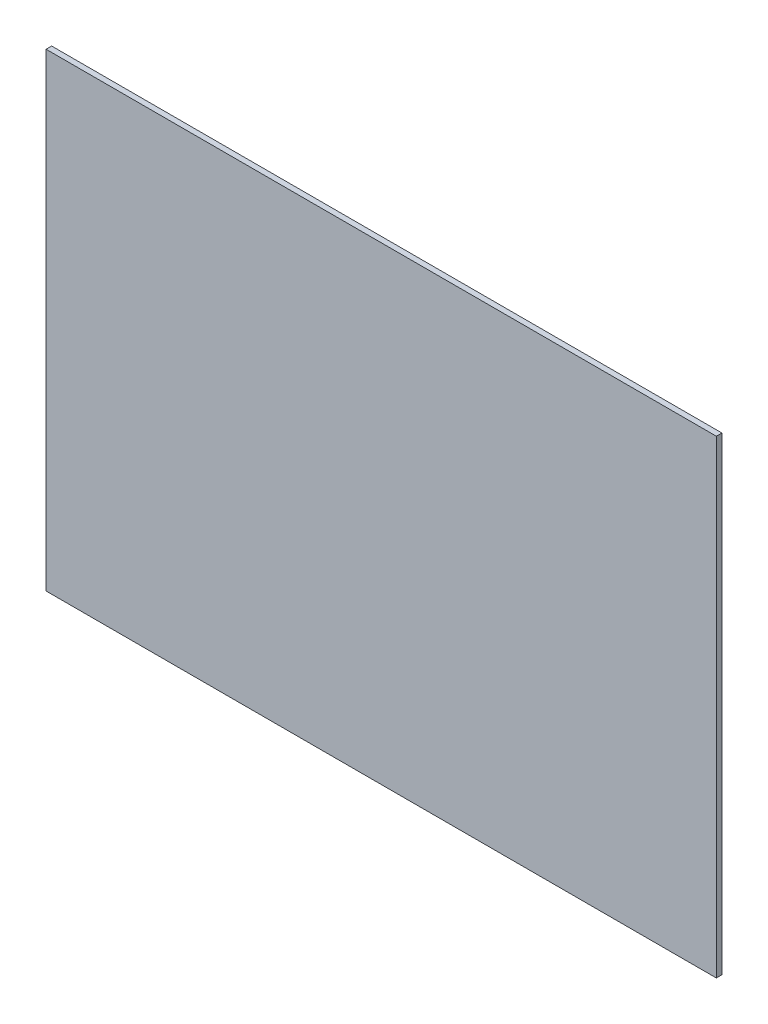
ISO-10303-21;
HEADER;
FILE_DESCRIPTION(('STEP AP214'),'2;1');
FILE_NAME('part.step','',(''),(''),'','','');
FILE_SCHEMA(('AUTOMOTIVE_DESIGN { 1 0 10303 214 1 1 1 1 }'));
ENDSEC;
DATA;
#1=APPLICATION_CONTEXT('core data for automotive mechanical design processes');
#2=APPLICATION_PROTOCOL_DEFINITION('international standard','automotive_design',2000,#1);
#3=PRODUCT_CONTEXT('',#1,'mechanical');
#4=PRODUCT('Part','Part','',(#3));
#5=PRODUCT_RELATED_PRODUCT_CATEGORY('part','',(#4));
#6=PRODUCT_DEFINITION_FORMATION('','',#4);
#7=PRODUCT_DEFINITION_CONTEXT('part definition',#1,'design');
#8=PRODUCT_DEFINITION('design','',#6,#7);
#9=PRODUCT_DEFINITION_SHAPE('','',#8);
#10=(LENGTH_UNIT() NAMED_UNIT(*) SI_UNIT(.MILLI.,.METRE.));
#11=(NAMED_UNIT(*) PLANE_ANGLE_UNIT() SI_UNIT($,.RADIAN.));
#12=(NAMED_UNIT(*) SI_UNIT($,.STERADIAN.) SOLID_ANGLE_UNIT());
#13=UNCERTAINTY_MEASURE_WITH_UNIT(LENGTH_MEASURE(1.E-05),#10,'distance_accuracy_value','');
#14=(GEOMETRIC_REPRESENTATION_CONTEXT(3) GLOBAL_UNCERTAINTY_ASSIGNED_CONTEXT((#13)) GLOBAL_UNIT_ASSIGNED_CONTEXT((#10,
#11,#12)) REPRESENTATION_CONTEXT('',''));
#15=CARTESIAN_POINT('',(0.,0.,0.));
#16=DIRECTION('',(0.,0.,1.));
#17=DIRECTION('',(1.,0.,0.));
#18=AXIS2_PLACEMENT_3D('',#15,#16,#17);
#19=CARTESIAN_POINT('',(0.,0.,1.5875));
#20=DIRECTION('',(1.,0.,0.));
#21=DIRECTION('',(0.,0.,-1.));
#22=AXIS2_PLACEMENT_3D('',#19,#20,#21);
#23=PLANE('',#22);
#24=DIRECTION('',(0.,-1.,0.));
#25=VECTOR('',#24,1.);
#26=CARTESIAN_POINT('',(0.,0.,0.));
#27=LINE('',#26,#25);
#28=CARTESIAN_POINT('',(0.,133.35,0.));
#29=VERTEX_POINT('',#28);
#30=CARTESIAN_POINT('',(0.,0.,0.));
#31=VERTEX_POINT('',#30);
#32=EDGE_CURVE('E96',#29,#31,#27,.T.);
#33=ORIENTED_EDGE('',*,*,#32,.T.);
#34=DIRECTION('',(0.,0.,-1.));
#35=VECTOR('',#34,1.);
#36=CARTESIAN_POINT('',(0.,0.,1.5875));
#37=LINE('',#36,#35);
#38=CARTESIAN_POINT('',(0.,0.,1.5875));
#39=VERTEX_POINT('',#38);
#40=EDGE_CURVE('E11',#39,#31,#37,.T.);
#41=ORIENTED_EDGE('',*,*,#40,.F.);
#42=DIRECTION('',(0.,-1.,0.));
#43=VECTOR('',#42,1.);
#44=CARTESIAN_POINT('',(0.,0.,1.5875));
#45=LINE('',#44,#43);
#46=CARTESIAN_POINT('',(0.,133.35,1.5875));
#47=VERTEX_POINT('',#46);
#48=EDGE_CURVE('E84',#47,#39,#45,.T.);
#49=ORIENTED_EDGE('',*,*,#48,.F.);
#50=DIRECTION('',(0.,0.,-1.));
#51=VECTOR('',#50,1.);
#52=CARTESIAN_POINT('',(0.,133.35,1.5875));
#53=LINE('',#52,#51);
#54=EDGE_CURVE('E92',#47,#29,#53,.T.);
#55=ORIENTED_EDGE('',*,*,#54,.T.);
#56=EDGE_LOOP('',(#33,#41,#49,#55));
#57=FACE_BOUND('',#56,.T.);
#58=ADVANCED_FACE('F33',(#57),#23,.F.);
#59=CARTESIAN_POINT('',(0.,0.,1.5875));
#60=DIRECTION('',(0.,1.,0.));
#61=DIRECTION('',(0.,0.,1.));
#62=AXIS2_PLACEMENT_3D('',#59,#60,#61);
#63=PLANE('',#62);
#64=DIRECTION('',(1.,0.,0.));
#65=VECTOR('',#64,1.);
#66=CARTESIAN_POINT('',(0.,0.,0.));
#67=LINE('',#66,#65);
#68=CARTESIAN_POINT('',(190.5,0.,0.));
#69=VERTEX_POINT('',#68);
#70=EDGE_CURVE('E88',#31,#69,#67,.T.);
#71=ORIENTED_EDGE('',*,*,#70,.T.);
#72=DIRECTION('',(0.,0.,-1.));
#73=VECTOR('',#72,1.);
#74=CARTESIAN_POINT('',(190.5,0.,1.5875));
#75=LINE('',#74,#73);
#76=CARTESIAN_POINT('',(190.5,0.,1.5875));
#77=VERTEX_POINT('',#76);
#78=EDGE_CURVE('E41',#77,#69,#75,.T.);
#79=ORIENTED_EDGE('',*,*,#78,.F.);
#80=DIRECTION('',(1.,0.,0.));
#81=VECTOR('',#80,1.);
#82=CARTESIAN_POINT('',(0.,0.,1.5875));
#83=LINE('',#82,#81);
#84=EDGE_CURVE('E79',#39,#77,#83,.T.);
#85=ORIENTED_EDGE('',*,*,#84,.F.);
#86=ORIENTED_EDGE('',*,*,#40,.T.);
#87=EDGE_LOOP('',(#71,#79,#85,#86));
#88=FACE_BOUND('',#87,.T.);
#89=ADVANCED_FACE('F87',(#88),#63,.F.);
#90=CARTESIAN_POINT('',(190.5,0.,1.5875));
#91=DIRECTION('',(-1.,0.,0.));
#92=DIRECTION('',(0.,0.,1.));
#93=AXIS2_PLACEMENT_3D('',#90,#91,#92);
#94=PLANE('',#93);
#95=DIRECTION('',(0.,1.,0.));
#96=VECTOR('',#95,1.);
#97=CARTESIAN_POINT('',(190.5,0.,0.));
#98=LINE('',#97,#96);
#99=CARTESIAN_POINT('',(190.5,133.35,0.));
#100=VERTEX_POINT('',#99);
#101=EDGE_CURVE('E66',#69,#100,#98,.T.);
#102=ORIENTED_EDGE('',*,*,#101,.T.);
#103=DIRECTION('',(0.,0.,-1.));
#104=VECTOR('',#103,1.);
#105=CARTESIAN_POINT('',(190.5,133.35,1.5875));
#106=LINE('',#105,#104);
#107=CARTESIAN_POINT('',(190.5,133.35,1.5875));
#108=VERTEX_POINT('',#107);
#109=EDGE_CURVE('E89',#108,#100,#106,.T.);
#110=ORIENTED_EDGE('',*,*,#109,.F.);
#111=DIRECTION('',(0.,1.,0.));
#112=VECTOR('',#111,1.);
#113=CARTESIAN_POINT('',(190.5,0.,1.5875));
#114=LINE('',#113,#112);
#115=EDGE_CURVE('E82',#77,#108,#114,.T.);
#116=ORIENTED_EDGE('',*,*,#115,.F.);
#117=ORIENTED_EDGE('',*,*,#78,.T.);
#118=EDGE_LOOP('',(#102,#110,#116,#117));
#119=FACE_BOUND('',#118,.T.);
#120=ADVANCED_FACE('F90',(#119),#94,.F.);
#121=CARTESIAN_POINT('',(0.,133.35,1.5875));
#122=DIRECTION('',(0.,-1.,0.));
#123=DIRECTION('',(0.,0.,-1.));
#124=AXIS2_PLACEMENT_3D('',#121,#122,#123);
#125=PLANE('',#124);
#126=DIRECTION('',(-1.,0.,0.));
#127=VECTOR('',#126,1.);
#128=CARTESIAN_POINT('',(0.,133.35,0.));
#129=LINE('',#128,#127);
#130=EDGE_CURVE('E72',#100,#29,#129,.T.);
#131=ORIENTED_EDGE('',*,*,#130,.T.);
#132=ORIENTED_EDGE('',*,*,#54,.F.);
#133=DIRECTION('',(-1.,0.,0.));
#134=VECTOR('',#133,1.);
#135=CARTESIAN_POINT('',(0.,133.35,1.5875));
#136=LINE('',#135,#134);
#137=EDGE_CURVE('E49',#108,#47,#136,.T.);
#138=ORIENTED_EDGE('',*,*,#137,.F.);
#139=ORIENTED_EDGE('',*,*,#109,.T.);
#140=EDGE_LOOP('',(#131,#132,#138,#139));
#141=FACE_BOUND('',#140,.T.);
#142=ADVANCED_FACE('F103',(#141),#125,.F.);
#143=CARTESIAN_POINT('',(0.,0.,1.5875));
#144=DIRECTION('',(0.,0.,-1.));
#145=DIRECTION('',(-1.,0.,0.));
#146=AXIS2_PLACEMENT_3D('',#143,#144,#145);
#147=PLANE('',#146);
#148=ORIENTED_EDGE('',*,*,#48,.T.);
#149=ORIENTED_EDGE('',*,*,#84,.T.);
#150=ORIENTED_EDGE('',*,*,#115,.T.);
#151=ORIENTED_EDGE('',*,*,#137,.T.);
#152=EDGE_LOOP('',(#148,#149,#150,#151));
#153=FACE_BOUND('',#152,.T.);
#154=ADVANCED_FACE('F80',(#153),#147,.F.);
#155=CARTESIAN_POINT('',(0.,0.,0.));
#156=DIRECTION('',(0.,0.,-1.));
#157=DIRECTION('',(-1.,0.,0.));
#158=AXIS2_PLACEMENT_3D('',#155,#156,#157);
#159=PLANE('',#158);
#160=ORIENTED_EDGE('',*,*,#32,.F.);
#161=ORIENTED_EDGE('',*,*,#130,.F.);
#162=ORIENTED_EDGE('',*,*,#101,.F.);
#163=ORIENTED_EDGE('',*,*,#70,.F.);
#164=EDGE_LOOP('',(#160,#161,#162,#163));
#165=FACE_BOUND('',#164,.T.);
#166=ADVANCED_FACE('F106',(#165),#159,.T.);
#167=CLOSED_SHELL('',(#58,#89,#120,#142,#154,#166));
#168=MANIFOLD_SOLID_BREP('B2',#167);
#169=ADVANCED_BREP_SHAPE_REPRESENTATION('',(#18,#168),#14);
#170=SHAPE_DEFINITION_REPRESENTATION(#9,#169);
ENDSEC;
END-ISO-10303-21;
